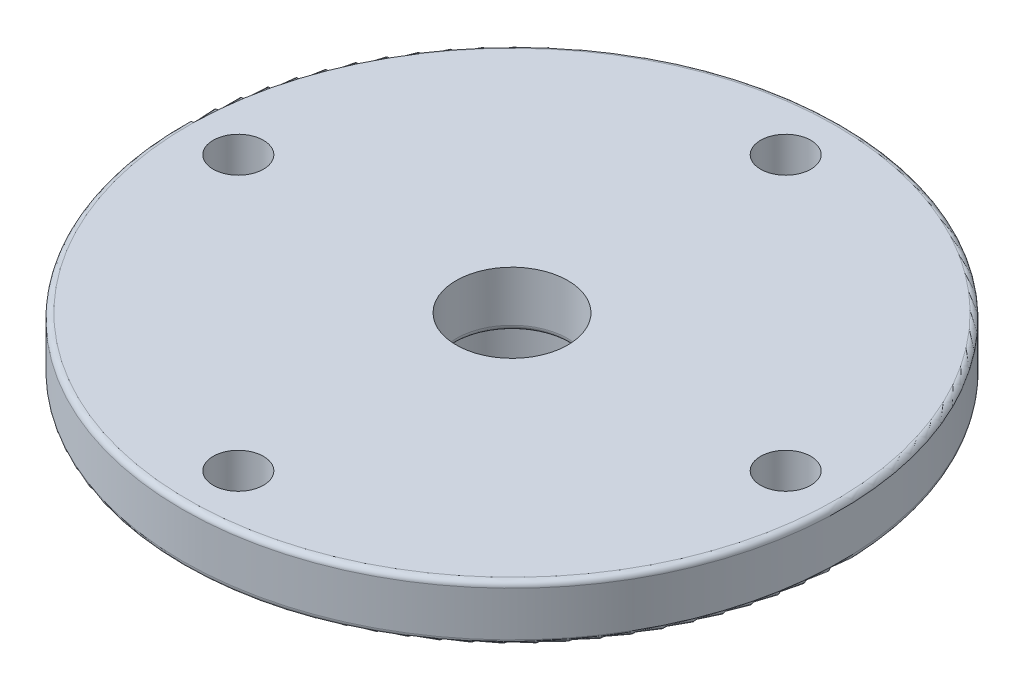
ISO-10303-21;
HEADER;
FILE_DESCRIPTION(('STEP AP214'),'2;1');
FILE_NAME('part.step','',(''),(''),'','','');
FILE_SCHEMA(('AUTOMOTIVE_DESIGN { 1 0 10303 214 1 1 1 1 }'));
ENDSEC;
DATA;
#1=APPLICATION_CONTEXT('core data for automotive mechanical design processes');
#2=APPLICATION_PROTOCOL_DEFINITION('international standard','automotive_design',2000,#1);
#3=PRODUCT_CONTEXT('',#1,'mechanical');
#4=PRODUCT('Part','Part','',(#3));
#5=PRODUCT_RELATED_PRODUCT_CATEGORY('part','',(#4));
#6=PRODUCT_DEFINITION_FORMATION('','',#4);
#7=PRODUCT_DEFINITION_CONTEXT('part definition',#1,'design');
#8=PRODUCT_DEFINITION('design','',#6,#7);
#9=PRODUCT_DEFINITION_SHAPE('','',#8);
#10=(LENGTH_UNIT() NAMED_UNIT(*) SI_UNIT(.MILLI.,.METRE.));
#11=(NAMED_UNIT(*) PLANE_ANGLE_UNIT() SI_UNIT($,.RADIAN.));
#12=(NAMED_UNIT(*) SI_UNIT($,.STERADIAN.) SOLID_ANGLE_UNIT());
#13=UNCERTAINTY_MEASURE_WITH_UNIT(LENGTH_MEASURE(1.E-05),#10,'distance_accuracy_value','');
#14=(GEOMETRIC_REPRESENTATION_CONTEXT(3) GLOBAL_UNCERTAINTY_ASSIGNED_CONTEXT((#13)) GLOBAL_UNIT_ASSIGNED_CONTEXT((#10,
#11,#12)) REPRESENTATION_CONTEXT('',''));
#15=CARTESIAN_POINT('',(0.,0.,0.));
#16=DIRECTION('',(0.,0.,1.));
#17=DIRECTION('',(1.,0.,0.));
#18=AXIS2_PLACEMENT_3D('',#15,#16,#17);
#19=CARTESIAN_POINT('',(-6.5,115.,0.));
#20=DIRECTION('',(0.,1.,0.));
#21=DIRECTION('',(0.,0.,1.));
#22=AXIS2_PLACEMENT_3D('',#19,#20,#21);
#23=PLANE('',#22);
#24=CARTESIAN_POINT('',(0.,115.,0.));
#25=DIRECTION('',(0.,1.,0.));
#26=DIRECTION('',(0.,0.,1.));
#27=AXIS2_PLACEMENT_3D('',#24,#25,#26);
#28=CIRCLE('',#27,6.);
#29=CARTESIAN_POINT('',(0.,115.,6.));
#30=VERTEX_POINT('',#29);
#31=EDGE_CURVE('E10',#30,#30,#28,.F.);
#32=ORIENTED_EDGE('',*,*,#31,.T.);
#33=EDGE_LOOP('',(#32));
#34=FACE_BOUND('',#33,.T.);
#35=CARTESIAN_POINT('',(0.,115.,0.));
#36=DIRECTION('',(0.,1.,0.));
#37=DIRECTION('',(0.,0.,1.));
#38=AXIS2_PLACEMENT_3D('',#35,#36,#37);
#39=CIRCLE('',#38,5.5);
#40=CARTESIAN_POINT('',(0.,115.,5.5));
#41=VERTEX_POINT('',#40);
#42=EDGE_CURVE('E97',#41,#41,#39,.T.);
#43=ORIENTED_EDGE('',*,*,#42,.T.);
#44=EDGE_LOOP('',(#43));
#45=FACE_BOUND('',#44,.T.);
#46=ADVANCED_FACE('F41',(#34,#45),#23,.F.);
#47=CARTESIAN_POINT('',(0.,105.,0.));
#48=DIRECTION('',(0.,-1.,0.));
#49=DIRECTION('',(0.,0.,-1.));
#50=AXIS2_PLACEMENT_3D('',#47,#48,#49);
#51=CYLINDRICAL_SURFACE('',#50,5.);
#52=CARTESIAN_POINT('',(0.,115.5,0.));
#53=DIRECTION('',(0.,1.,0.));
#54=DIRECTION('',(0.,0.,1.));
#55=AXIS2_PLACEMENT_3D('',#52,#53,#54);
#56=CIRCLE('',#55,5.);
#57=CARTESIAN_POINT('',(0.,115.5,5.));
#58=VERTEX_POINT('',#57);
#59=EDGE_CURVE('E101',#58,#58,#56,.F.);
#60=ORIENTED_EDGE('',*,*,#59,.T.);
#61=EDGE_LOOP('',(#60));
#62=FACE_BOUND('',#61,.T.);
#63=CARTESIAN_POINT('',(0.,120.,0.));
#64=DIRECTION('',(0.,-1.,0.));
#65=DIRECTION('',(0.,0.,-1.));
#66=AXIS2_PLACEMENT_3D('',#63,#64,#65);
#67=CIRCLE('',#66,5.);
#68=CARTESIAN_POINT('',(0.,120.,-5.));
#69=VERTEX_POINT('',#68);
#70=EDGE_CURVE('E105',#69,#69,#67,.T.);
#71=ORIENTED_EDGE('',*,*,#70,.F.);
#72=EDGE_LOOP('',(#71));
#73=FACE_BOUND('',#72,.T.);
#74=ADVANCED_FACE('F171',(#62,#73),#51,.F.);
#75=CARTESIAN_POINT('',(-29.5,120.,0.));
#76=DIRECTION('',(0.,-1.,0.));
#77=DIRECTION('',(0.,0.,-1.));
#78=AXIS2_PLACEMENT_3D('',#75,#76,#77);
#79=PLANE('',#78);
#80=CARTESIAN_POINT('',(0.,120.,0.));
#81=DIRECTION('',(0.,-1.,0.));
#82=DIRECTION('',(0.,0.,-1.));
#83=AXIS2_PLACEMENT_3D('',#80,#81,#82);
#84=CIRCLE('',#83,29.);
#85=CARTESIAN_POINT('',(0.,120.,-29.));
#86=VERTEX_POINT('',#85);
#87=EDGE_CURVE('E85',#86,#86,#84,.F.);
#88=ORIENTED_EDGE('',*,*,#87,.T.);
#89=EDGE_LOOP('',(#88));
#90=FACE_BOUND('',#89,.T.);
#91=CARTESIAN_POINT('',(-24.5,120.,0.));
#92=DIRECTION('',(0.,-1.,0.));
#93=DIRECTION('',(0.,0.,-1.));
#94=AXIS2_PLACEMENT_3D('',#91,#92,#93);
#95=CIRCLE('',#94,2.24999999999999);
#96=CARTESIAN_POINT('',(-24.5,120.,-2.24999999999999));
#97=VERTEX_POINT('',#96);
#98=EDGE_CURVE('E133',#97,#97,#95,.T.);
#99=ORIENTED_EDGE('',*,*,#98,.T.);
#100=EDGE_LOOP('',(#99));
#101=FACE_BOUND('',#100,.T.);
#102=CARTESIAN_POINT('',(0.,120.,24.5));
#103=DIRECTION('',(0.,-1.,0.));
#104=DIRECTION('',(0.,0.,-1.));
#105=AXIS2_PLACEMENT_3D('',#102,#103,#104);
#106=CIRCLE('',#105,2.24999999999999);
#107=CARTESIAN_POINT('',(0.,120.,22.25));
#108=VERTEX_POINT('',#107);
#109=EDGE_CURVE('E125',#108,#108,#106,.T.);
#110=ORIENTED_EDGE('',*,*,#109,.T.);
#111=EDGE_LOOP('',(#110));
#112=FACE_BOUND('',#111,.T.);
#113=CARTESIAN_POINT('',(24.5,120.,0.));
#114=DIRECTION('',(0.,-1.,0.));
#115=DIRECTION('',(0.,0.,-1.));
#116=AXIS2_PLACEMENT_3D('',#113,#114,#115);
#117=CIRCLE('',#116,2.24999999999999);
#118=CARTESIAN_POINT('',(24.5,120.,-2.24999999999999));
#119=VERTEX_POINT('',#118);
#120=EDGE_CURVE('E117',#119,#119,#117,.T.);
#121=ORIENTED_EDGE('',*,*,#120,.T.);
#122=EDGE_LOOP('',(#121));
#123=FACE_BOUND('',#122,.T.);
#124=CARTESIAN_POINT('',(0.,120.,-24.5));
#125=DIRECTION('',(0.,-1.,0.));
#126=DIRECTION('',(0.,0.,-1.));
#127=AXIS2_PLACEMENT_3D('',#124,#125,#126);
#128=CIRCLE('',#127,2.24999999999999);
#129=CARTESIAN_POINT('',(0.,120.,-26.75));
#130=VERTEX_POINT('',#129);
#131=EDGE_CURVE('E109',#130,#130,#128,.T.);
#132=ORIENTED_EDGE('',*,*,#131,.T.);
#133=EDGE_LOOP('',(#132));
#134=FACE_BOUND('',#133,.T.);
#135=ORIENTED_EDGE('',*,*,#70,.T.);
#136=EDGE_LOOP('',(#135));
#137=FACE_BOUND('',#136,.T.);
#138=ADVANCED_FACE('F176',(#90,#101,#112,#123,#134,#137),#79,.F.);
#139=CARTESIAN_POINT('',(0.,105.,0.));
#140=DIRECTION('',(0.,-1.,0.));
#141=DIRECTION('',(0.,0.,-1.));
#142=AXIS2_PLACEMENT_3D('',#139,#140,#141);
#143=CYLINDRICAL_SURFACE('',#142,29.5);
#144=CARTESIAN_POINT('',(0.,119.5,0.));
#145=DIRECTION('',(0.,-1.,0.));
#146=DIRECTION('',(0.,0.,-1.));
#147=AXIS2_PLACEMENT_3D('',#144,#145,#146);
#148=CIRCLE('',#147,29.5);
#149=CARTESIAN_POINT('',(0.,119.5,-29.5));
#150=VERTEX_POINT('',#149);
#151=EDGE_CURVE('E89',#150,#150,#148,.T.);
#152=ORIENTED_EDGE('',*,*,#151,.T.);
#153=EDGE_LOOP('',(#152));
#154=FACE_BOUND('',#153,.T.);
#155=CARTESIAN_POINT('',(0.,115.5,0.));
#156=DIRECTION('',(0.,1.,0.));
#157=DIRECTION('',(0.,0.,1.));
#158=AXIS2_PLACEMENT_3D('',#155,#156,#157);
#159=CIRCLE('',#158,29.5);
#160=CARTESIAN_POINT('',(0.,115.5,29.5));
#161=VERTEX_POINT('',#160);
#162=EDGE_CURVE('E93',#161,#161,#159,.T.);
#163=ORIENTED_EDGE('',*,*,#162,.T.);
#164=EDGE_LOOP('',(#163));
#165=FACE_BOUND('',#164,.T.);
#166=ADVANCED_FACE('F235',(#154,#165),#143,.T.);
#167=CARTESIAN_POINT('',(-9.5,115.,0.));
#168=DIRECTION('',(0.,1.,0.));
#169=DIRECTION('',(0.,0.,1.));
#170=AXIS2_PLACEMENT_3D('',#167,#168,#169);
#171=PLANE('',#170);
#172=CARTESIAN_POINT('',(0.,115.,0.));
#173=DIRECTION('',(0.,1.,0.));
#174=DIRECTION('',(0.,0.,1.));
#175=AXIS2_PLACEMENT_3D('',#172,#173,#174);
#176=CIRCLE('',#175,29.);
#177=CARTESIAN_POINT('',(0.,115.,29.));
#178=VERTEX_POINT('',#177);
#179=EDGE_CURVE('E77',#178,#178,#176,.F.);
#180=ORIENTED_EDGE('',*,*,#179,.T.);
#181=EDGE_LOOP('',(#180));
#182=FACE_BOUND('',#181,.T.);
#183=CARTESIAN_POINT('',(0.,115.,0.));
#184=DIRECTION('',(0.,1.,0.));
#185=DIRECTION('',(0.,0.,1.));
#186=AXIS2_PLACEMENT_3D('',#183,#184,#185);
#187=CIRCLE('',#186,10.);
#188=CARTESIAN_POINT('',(0.,115.,10.));
#189=VERTEX_POINT('',#188);
#190=EDGE_CURVE('E81',#189,#189,#187,.T.);
#191=ORIENTED_EDGE('',*,*,#190,.T.);
#192=EDGE_LOOP('',(#191));
#193=FACE_BOUND('',#192,.T.);
#194=CARTESIAN_POINT('',(-24.5,115.,0.));
#195=DIRECTION('',(0.,-1.,0.));
#196=DIRECTION('',(0.,0.,-1.));
#197=AXIS2_PLACEMENT_3D('',#194,#195,#196);
#198=CIRCLE('',#197,2.24999999999999);
#199=CARTESIAN_POINT('',(-24.5,115.,-2.24999999999999));
#200=VERTEX_POINT('',#199);
#201=EDGE_CURVE('E137',#200,#200,#198,.T.);
#202=ORIENTED_EDGE('',*,*,#201,.F.);
#203=EDGE_LOOP('',(#202));
#204=FACE_BOUND('',#203,.T.);
#205=CARTESIAN_POINT('',(0.,115.,24.5));
#206=DIRECTION('',(0.,-1.,0.));
#207=DIRECTION('',(0.,0.,-1.));
#208=AXIS2_PLACEMENT_3D('',#205,#206,#207);
#209=CIRCLE('',#208,2.24999999999999);
#210=CARTESIAN_POINT('',(0.,115.,22.25));
#211=VERTEX_POINT('',#210);
#212=EDGE_CURVE('E129',#211,#211,#209,.T.);
#213=ORIENTED_EDGE('',*,*,#212,.F.);
#214=EDGE_LOOP('',(#213));
#215=FACE_BOUND('',#214,.T.);
#216=CARTESIAN_POINT('',(24.5,115.,0.));
#217=DIRECTION('',(0.,-1.,0.));
#218=DIRECTION('',(0.,0.,-1.));
#219=AXIS2_PLACEMENT_3D('',#216,#217,#218);
#220=CIRCLE('',#219,2.24999999999999);
#221=CARTESIAN_POINT('',(24.5,115.,-2.24999999999999));
#222=VERTEX_POINT('',#221);
#223=EDGE_CURVE('E121',#222,#222,#220,.T.);
#224=ORIENTED_EDGE('',*,*,#223,.F.);
#225=EDGE_LOOP('',(#224));
#226=FACE_BOUND('',#225,.T.);
#227=CARTESIAN_POINT('',(0.,115.,-24.5));
#228=DIRECTION('',(0.,-1.,0.));
#229=DIRECTION('',(0.,0.,-1.));
#230=AXIS2_PLACEMENT_3D('',#227,#228,#229);
#231=CIRCLE('',#230,2.24999999999999);
#232=CARTESIAN_POINT('',(0.,115.,-26.75));
#233=VERTEX_POINT('',#232);
#234=EDGE_CURVE('E113',#233,#233,#231,.T.);
#235=ORIENTED_EDGE('',*,*,#234,.F.);
#236=EDGE_LOOP('',(#235));
#237=FACE_BOUND('',#236,.T.);
#238=ADVANCED_FACE('F231',(#182,#193,#204,#215,#226,#237),#171,.F.);
#239=CARTESIAN_POINT('',(0.,105.,0.));
#240=DIRECTION('',(0.,-1.,0.));
#241=DIRECTION('',(0.,0.,-1.));
#242=AXIS2_PLACEMENT_3D('',#239,#240,#241);
#243=CYLINDRICAL_SURFACE('',#242,9.5);
#244=CARTESIAN_POINT('',(-9.41740410091868,110.,-1.24999999999999));
#245=CARTESIAN_POINT('',(-9.41740515040742,110.069886205349,-1.24999704789293));
#246=CARTESIAN_POINT('',(-9.41819043981181,110.139815327445,-1.24411931466304));
#247=CARTESIAN_POINT('',(-9.42124533027014,110.277725224789,-1.22076605843336));
#248=CARTESIAN_POINT('',(-9.42351645694713,110.345703922418,-1.2032786145807));
#249=CARTESIAN_POINT('',(-9.42928142888536,110.477696420154,-1.1572323217496));
#250=CARTESIAN_POINT('',(-9.43277441749336,110.541712961235,-1.12868122804132));
#251=CARTESIAN_POINT('',(-9.44058851379836,110.664035077796,-1.06133513403108));
#252=CARTESIAN_POINT('',(-9.44490948670654,110.722341580491,-1.0225418006908));
#253=CARTESIAN_POINT('',(-9.45392261518461,110.831960501985,-0.935555536447476));
#254=CARTESIAN_POINT('',(-9.45861669074954,110.883232472384,-0.887311826136348));
#255=CARTESIAN_POINT('',(-9.46782988877771,110.976977226731,-0.782903691498034));
#256=CARTESIAN_POINT('',(-9.47234900230879,111.019449561922,-0.726738863459757));
#257=CARTESIAN_POINT('',(-9.48072286825033,111.094535628773,-0.607827237142816));
#258=CARTESIAN_POINT('',(-9.48457511969083,111.127112579641,-0.545057022732154));
#259=CARTESIAN_POINT('',(-9.49116007065744,111.181247447053,-0.41487734336002));
#260=CARTESIAN_POINT('',(-9.49389281603899,111.20280581493,-0.347468068548576));
#261=CARTESIAN_POINT('',(-9.4979173195322,111.234170222602,-0.210338313470613));
#262=CARTESIAN_POINT('',(-9.49921733795251,111.244043655884,-0.140633493799677));
#263=CARTESIAN_POINT('',(-9.50025814474571,111.251966884468,-0.000545054460519552));
#264=CARTESIAN_POINT('',(-9.49999900070088,111.250017192246,0.0698385356542006));
#265=CARTESIAN_POINT('',(-9.49795734365724,111.234403320736,0.208827747812643));
#266=CARTESIAN_POINT('',(-9.4961842570123,111.220811627099,0.277441670791973));
#267=CARTESIAN_POINT('',(-9.49132449458133,111.182412996434,0.411406214346115));
#268=CARTESIAN_POINT('',(-9.48823779157073,111.157605826965,0.476756767256544));
#269=CARTESIAN_POINT('',(-9.48108137373616,111.09740405726,0.602562678419372));
#270=CARTESIAN_POINT('',(-9.47700877286313,111.061978299016,0.663002955821209));
#271=CARTESIAN_POINT('',(-9.46833577460663,110.98156764371,0.777108144066745));
#272=CARTESIAN_POINT('',(-9.46373535042145,110.936582261133,0.830772710563963));
#273=CARTESIAN_POINT('',(-9.45447999803414,110.837923873158,0.930229349088635));
#274=CARTESIAN_POINT('',(-9.44982492089106,110.784187665752,0.975958735268482));
#275=CARTESIAN_POINT('',(-9.44101919770809,110.669769523819,1.05775916328446));
#276=CARTESIAN_POINT('',(-9.43686855357354,110.609087563058,1.09383016863954));
#277=CARTESIAN_POINT('',(-9.42954174057462,110.482442272949,1.1552946873874));
#278=CARTESIAN_POINT('',(-9.42636606200229,110.41647630733,1.18068283093786));
#279=CARTESIAN_POINT('',(-9.42135807082555,110.281166135925,1.22000353371584));
#280=CARTESIAN_POINT('',(-9.41952568621592,110.211822111427,1.23393670697445));
#281=CARTESIAN_POINT('',(-9.41742505133737,110.072278885302,1.24986821658864));
#282=CARTESIAN_POINT('',(-9.41714521920936,110.002089941338,1.25195492887753));
#283=CARTESIAN_POINT('',(-9.41815071410225,109.862363443552,1.24436778967091));
#284=CARTESIAN_POINT('',(-9.41943600405816,109.792825874345,1.23469421668076));
#285=CARTESIAN_POINT('',(-9.42341633828856,109.65664307734,1.20393565087208));
#286=CARTESIAN_POINT('',(-9.42610605718738,109.589987946535,1.1828937545738));
#287=CARTESIAN_POINT('',(-9.43258785218585,109.461151704626,1.13004032110573));
#288=CARTESIAN_POINT('',(-9.43637997094961,109.398970766795,1.09822836711485));
#289=CARTESIAN_POINT('',(-9.44466692307172,109.280449060262,1.02452177647129));
#290=CARTESIAN_POINT('',(-9.44916572917077,109.224144501115,0.982569368171447));
#291=CARTESIAN_POINT('',(-9.45834681086385,109.119343968871,0.889854075114491));
#292=CARTESIAN_POINT('',(-9.46302909437602,109.070848333238,0.839090809792198));
#293=CARTESIAN_POINT('',(-9.47208528996797,108.982730105689,0.729807943556198));
#294=CARTESIAN_POINT('',(-9.47645705911991,108.943165709042,0.671241214786109));
#295=CARTESIAN_POINT('',(-9.48436730464789,108.874436400601,0.548242056186275));
#296=CARTESIAN_POINT('',(-9.48790579935237,108.845271260061,0.483809755416941));
#297=CARTESIAN_POINT('',(-9.49374132443193,108.79826369334,0.351098939428531));
#298=CARTESIAN_POINT('',(-9.49604199025897,108.780388083095,0.282832344858804));
#299=CARTESIAN_POINT('',(-9.49915777375567,108.756359174225,0.144234307708302));
#300=CARTESIAN_POINT('',(-9.49997296602718,108.750205286923,0.0739029690011388));
#301=CARTESIAN_POINT('',(-9.50002550419145,108.749806338143,-0.0662608308191951));
#302=CARTESIAN_POINT('',(-9.49927471634213,108.755471715925,-0.136093049401187));
#303=CARTESIAN_POINT('',(-9.49630331821968,108.778360230814,-0.273803441283075));
#304=CARTESIAN_POINT('',(-9.49408270977212,108.795583353566,-0.341681617009858));
#305=CARTESIAN_POINT('',(-9.48842002745291,108.841069407478,-0.473542173562025));
#306=CARTESIAN_POINT('',(-9.48497848119331,108.869327570523,-0.537526223211862));
#307=CARTESIAN_POINT('',(-9.47725424463943,108.936072250293,-0.659858449122204));
#308=CARTESIAN_POINT('',(-9.47297153999953,108.974558941465,-0.718206529238161));
#309=CARTESIAN_POINT('',(-9.46400385926268,109.060997805309,-0.828067366506168));
#310=CARTESIAN_POINT('',(-9.45931619411569,109.109016519325,-0.879527552763566));
#311=CARTESIAN_POINT('',(-9.45008808874873,109.213017351824,-0.9736938777279));
#312=CARTESIAN_POINT('',(-9.44554768356159,109.269001348413,-1.01639794604752));
#313=CARTESIAN_POINT('',(-9.43710744957151,109.387620479169,-1.09199840888499));
#314=CARTESIAN_POINT('',(-9.43321044460901,109.450283045588,-1.12485205925342));
#315=CARTESIAN_POINT('',(-9.42653130552799,109.580253766044,-1.17952229042332));
#316=CARTESIAN_POINT('',(-9.42374797311329,109.647556835023,-1.20135074085916));
#317=CARTESIAN_POINT('',(-9.42027915781916,109.762664568872,-1.22819129159687));
#318=CARTESIAN_POINT('',(-9.41920646480158,109.809746593527,-1.23635761509663));
#319=CARTESIAN_POINT('',(-9.41776858101801,109.904545741081,-1.24726295373764));
#320=CARTESIAN_POINT('',(-9.41740338404484,109.952262858405,-1.25000201649454));
#321=CARTESIAN_POINT('',(-9.41740410091868,110.,-1.24999999999999));
#322=B_SPLINE_CURVE_WITH_KNOTS('',3,(#244,#245,#246,#247,#248,#249,#250,#251,#252,#253,#254,
#255,#256,#257,#258,#259,#260,#261,#262,#263,#264,#265,#266,#267,#268,#269,#270,#271,#272,#273,
#274,#275,#276,#277,#278,#279,#280,#281,#282,#283,#284,#285,#286,#287,#288,#289,#290,#291,#292,
#293,#294,#295,#296,#297,#298,#299,#300,#301,#302,#303,#304,#305,#306,#307,#308,#309,#310,#311,
#312,#313,#314,#315,#316,#317,#318,#319,#320,#321),.UNSPECIFIED.,.T.,.F.,(4,2,2,2,2,2,2,2,2,2,2,
2,2,2,2,2,2,2,2,2,2,2,2,2,2,2,2,2,2,2,2,2,2,2,2,2,2,2,4),(0.,0.209484202571712,
0.419183836928705,0.628736743572684,0.838255565722038,1.04893269923857,1.2596205740993,
1.47108224647857,1.68253525643094,1.89276266234727,2.10298095597087,2.31189982011463,
2.52082301429179,2.73036535278697,2.93991833609115,3.15105801722778,3.36219849585732,
3.57344497984327,3.78468013945542,3.99433736908822,4.2039896337458,4.41285264161177,
4.62172373378566,4.83181406846403,5.04191347978166,5.25334471898744,5.46477130718729,
5.6755735069056,5.88636511965184,6.09556525763882,6.30476513579177,6.51387472089916,
6.72298787259739,6.93361567574767,7.14429322463347,7.35587216352336,7.56722283023417,
7.71031637390364,7.85340866214714),.UNSPECIFIED.);
#323=CARTESIAN_POINT('',(-9.41740410091868,110.,-1.24999999999999));
#324=VERTEX_POINT('',#323);
#325=EDGE_CURVE('E150',#324,#324,#322,.T.);
#326=ORIENTED_EDGE('',*,*,#325,.T.);
#327=EDGE_LOOP('',(#326));
#328=FACE_BOUND('',#327,.T.);
#329=CARTESIAN_POINT('',(0.,105.5,0.));
#330=DIRECTION('',(0.,1.,0.));
#331=DIRECTION('',(0.,0.,1.));
#332=AXIS2_PLACEMENT_3D('',#329,#330,#331);
#333=CIRCLE('',#332,9.5);
#334=CARTESIAN_POINT('',(0.,105.5,9.5));
#335=VERTEX_POINT('',#334);
#336=EDGE_CURVE('E65',#335,#335,#333,.T.);
#337=ORIENTED_EDGE('',*,*,#336,.T.);
#338=EDGE_LOOP('',(#337));
#339=FACE_BOUND('',#338,.T.);
#340=CARTESIAN_POINT('',(0.,114.5,0.));
#341=DIRECTION('',(0.,1.,0.));
#342=DIRECTION('',(0.,0.,1.));
#343=AXIS2_PLACEMENT_3D('',#340,#341,#342);
#344=CIRCLE('',#343,9.5);
#345=CARTESIAN_POINT('',(0.,114.5,9.5));
#346=VERTEX_POINT('',#345);
#347=EDGE_CURVE('E69',#346,#346,#344,.F.);
#348=ORIENTED_EDGE('',*,*,#347,.T.);
#349=EDGE_LOOP('',(#348));
#350=FACE_BOUND('',#349,.T.);
#351=ADVANCED_FACE('F225',(#328,#339,#350),#243,.T.);
#352=CARTESIAN_POINT('',(-6.5,105.,0.));
#353=DIRECTION('',(0.,1.,0.));
#354=DIRECTION('',(0.,0.,1.));
#355=AXIS2_PLACEMENT_3D('',#352,#353,#354);
#356=PLANE('',#355);
#357=CARTESIAN_POINT('',(0.,105.,0.));
#358=DIRECTION('',(0.,1.,0.));
#359=DIRECTION('',(0.,0.,1.));
#360=AXIS2_PLACEMENT_3D('',#357,#358,#359);
#361=CIRCLE('',#360,7.);
#362=CARTESIAN_POINT('',(0.,105.,7.));
#363=VERTEX_POINT('',#362);
#364=EDGE_CURVE('E49',#363,#363,#361,.T.);
#365=ORIENTED_EDGE('',*,*,#364,.T.);
#366=EDGE_LOOP('',(#365));
#367=FACE_BOUND('',#366,.T.);
#368=CARTESIAN_POINT('',(0.,105.,0.));
#369=DIRECTION('',(0.,1.,0.));
#370=DIRECTION('',(0.,0.,1.));
#371=AXIS2_PLACEMENT_3D('',#368,#369,#370);
#372=CIRCLE('',#371,9.);
#373=CARTESIAN_POINT('',(0.,105.,9.));
#374=VERTEX_POINT('',#373);
#375=EDGE_CURVE('E73',#374,#374,#372,.F.);
#376=ORIENTED_EDGE('',*,*,#375,.T.);
#377=EDGE_LOOP('',(#376));
#378=FACE_BOUND('',#377,.T.);
#379=ADVANCED_FACE('F213',(#367,#378),#356,.F.);
#380=CARTESIAN_POINT('',(0.,105.,0.));
#381=DIRECTION('',(0.,-1.,0.));
#382=DIRECTION('',(0.,0.,-1.));
#383=AXIS2_PLACEMENT_3D('',#380,#381,#382);
#384=CYLINDRICAL_SURFACE('',#383,6.5);
#385=CARTESIAN_POINT('',(-6.5,108.75,0.));
#386=CARTESIAN_POINT('',(-6.49999873054918,108.75000262061,0.0695263300903777));
#387=CARTESIAN_POINT('',(-6.49887299034978,108.755820293649,0.139086386536078));
#388=CARTESIAN_POINT('',(-6.49449072478032,108.778920972431,0.276244066545679));
#389=CARTESIAN_POINT('',(-6.49123244093526,108.796213440343,0.343840022447296));
#390=CARTESIAN_POINT('',(-6.48294932466697,108.841712790244,0.475066268731183));
#391=CARTESIAN_POINT('',(-6.47792612463065,108.869909589137,0.538700159856868));
#392=CARTESIAN_POINT('',(-6.46666077439192,108.936388063963,0.660328619211793));
#393=CARTESIAN_POINT('',(-6.46041871297687,108.974669005393,0.718323597744219));
#394=CARTESIAN_POINT('',(-6.44731615012176,109.060739582854,0.827762164871103));
#395=CARTESIAN_POINT('',(-6.44044947743084,109.108631415726,0.879124647683762));
#396=CARTESIAN_POINT('',(-6.42691706808667,109.212344518597,0.973138343078074));
#397=CARTESIAN_POINT('',(-6.42025134636388,109.268166376038,1.01578890972675));
#398=CARTESIAN_POINT('',(-6.40781547009761,109.386731997679,1.0915083981031));
#399=CARTESIAN_POINT('',(-6.40205326632548,109.44952971555,1.12449425725112));
#400=CARTESIAN_POINT('',(-6.39216406280366,109.579904955013,1.17941610157592));
#401=CARTESIAN_POINT('',(-6.38803691434868,109.647482041271,1.20135309167638));
#402=CARTESIAN_POINT('',(-6.38194735063819,109.78462809586,1.23329305228568));
#403=CARTESIAN_POINT('',(-6.37995924110286,109.854162883349,1.2434377939577));
#404=CARTESIAN_POINT('',(-6.37829543879725,109.99397381846,1.25194545092379));
#405=CARTESIAN_POINT('',(-6.3786195277321,110.064249895472,1.25030947843595));
#406=CARTESIAN_POINT('',(-6.38152012920898,110.202517611581,1.23541697804275));
#407=CARTESIAN_POINT('',(-6.38406529733109,110.270527422382,1.22232215325025));
#408=CARTESIAN_POINT('',(-6.39107200195107,110.403366491558,1.18513854067888));
#409=CARTESIAN_POINT('',(-6.39553362370363,110.468195608294,1.16104926380164));
#410=CARTESIAN_POINT('',(-6.40590301761788,110.59330347191,1.10240382729655));
#411=CARTESIAN_POINT('',(-6.41181970353635,110.653551055254,1.06778282798613));
#412=CARTESIAN_POINT('',(-6.42442673553149,110.767442485569,0.989102525446724));
#413=CARTESIAN_POINT('',(-6.43111716402495,110.821085627796,0.94504221634322));
#414=CARTESIAN_POINT('',(-6.44465411904849,110.92117926711,0.847864455663331));
#415=CARTESIAN_POINT('',(-6.45150139326972,110.967495595018,0.794608805779961));
#416=CARTESIAN_POINT('',(-6.46447860514488,111.05055775365,0.681013328076993));
#417=CARTESIAN_POINT('',(-6.47060853487937,111.087303478721,0.620673422062238));
#418=CARTESIAN_POINT('',(-6.48147374305158,111.15020302352,0.494478881244396));
#419=CARTESIAN_POINT('',(-6.48620711303174,111.176342367309,0.428616856521533));
#420=CARTESIAN_POINT('',(-6.49373123608211,111.217148711673,0.293325284598558));
#421=CARTESIAN_POINT('',(-6.4965222064135,111.231816995333,0.223896137321171));
#422=CARTESIAN_POINT('',(-6.4998170641524,111.249076883077,0.084594957572311));
#423=CARTESIAN_POINT('',(-6.50035574677272,111.251852235921,0.014746488997661));
#424=CARTESIAN_POINT('',(-6.49918164994221,111.245741111402,-0.12441631829641));
#425=CARTESIAN_POINT('',(-6.497468987103,111.236855238049,-0.193730684493373));
#426=CARTESIAN_POINT('',(-6.49200634359787,111.207826628002,-0.329271121290108));
#427=CARTESIAN_POINT('',(-6.48827328656802,111.187777360787,-0.395517951862495));
#428=CARTESIAN_POINT('',(-6.47918677244289,111.137092609938,-0.523709778000943));
#429=CARTESIAN_POINT('',(-6.47383320094063,111.106456378851,-0.585654469459843));
#430=CARTESIAN_POINT('',(-6.46201273267351,111.035064128413,-0.704264341336219));
#431=CARTESIAN_POINT('',(-6.4555338112679,110.994196454232,-0.760861092631647));
#432=CARTESIAN_POINT('',(-6.44221127589378,110.903651888251,-0.866459302715507));
#433=CARTESIAN_POINT('',(-6.43536762602225,110.853974128083,-0.915460011904454));
#434=CARTESIAN_POINT('',(-6.42197081919612,110.746385919302,-1.0051775508243));
#435=CARTESIAN_POINT('',(-6.41542307578637,110.688369874859,-1.04576869619255));
#436=CARTESIAN_POINT('',(-6.40347051879715,110.566234837863,-1.11662974416658));
#437=CARTESIAN_POINT('',(-6.39806566143698,110.502116079226,-1.14690004216186));
#438=CARTESIAN_POINT('',(-6.38905378658871,110.369906820527,-1.19608442093858));
#439=CARTESIAN_POINT('',(-6.38543785792601,110.301837933266,-1.21505488797638));
#440=CARTESIAN_POINT('',(-6.38039343660705,110.163402463397,-1.24127395271722));
#441=CARTESIAN_POINT('',(-6.37896468278173,110.093036156146,-1.24852394995943));
#442=CARTESIAN_POINT('',(-6.37847010253234,109.953263322039,-1.25104755843672));
#443=CARTESIAN_POINT('',(-6.37936513521924,109.883860438516,-1.24651955106102));
#444=CARTESIAN_POINT('',(-6.3833302398308,109.746825027747,-1.22605133269019));
#445=CARTESIAN_POINT('',(-6.38640029712568,109.679192488596,-1.21011119845592));
#446=CARTESIAN_POINT('',(-6.39435266298136,109.547731690079,-1.16735673858748));
#447=CARTESIAN_POINT('',(-6.39923121033494,109.483895852041,-1.14056497100193));
#448=CARTESIAN_POINT('',(-6.4102533266987,109.361593819055,-1.07688985392762));
#449=CARTESIAN_POINT('',(-6.41639699144119,109.303128030946,-1.04000574067458));
#450=CARTESIAN_POINT('',(-6.42937795151368,109.192234212658,-0.956507819072124));
#451=CARTESIAN_POINT('',(-6.43622463982556,109.139915659259,-0.909750049269207));
#452=CARTESIAN_POINT('',(-6.44977101580729,109.043801312253,-0.808131192425024));
#453=CARTESIAN_POINT('',(-6.45647066935191,109.000007478966,-0.753268246630355));
#454=CARTESIAN_POINT('',(-6.46904328529454,108.921793491572,-0.6363681286733));
#455=CARTESIAN_POINT('',(-6.47490774506217,108.887466814965,-0.574267467434694));
#456=CARTESIAN_POINT('',(-6.48506595383496,108.829789603818,-0.445086129675195));
#457=CARTESIAN_POINT('',(-6.48936115496814,108.806428916066,-0.378010126647418));
#458=CARTESIAN_POINT('',(-6.49503671875109,108.776007707893,-0.258961782852765));
#459=CARTESIAN_POINT('',(-6.49688729501668,108.766271755124,-0.207678719850832));
#460=CARTESIAN_POINT('',(-6.49936939476943,108.753267008181,-0.104270079257339));
#461=CARTESIAN_POINT('',(-6.50000095208405,108.749998034551,-0.0521445250851613));
#462=CARTESIAN_POINT('',(-6.5,108.75,0.));
#463=B_SPLINE_CURVE_WITH_KNOTS('',3,(#385,#386,#387,#388,#389,#390,#391,#392,#393,#394,#395,
#396,#397,#398,#399,#400,#401,#402,#403,#404,#405,#406,#407,#408,#409,#410,#411,#412,#413,#414,
#415,#416,#417,#418,#419,#420,#421,#422,#423,#424,#425,#426,#427,#428,#429,#430,#431,#432,#433,
#434,#435,#436,#437,#438,#439,#440,#441,#442,#443,#444,#445,#446,#447,#448,#449,#450,#451,#452,
#453,#454,#455,#456,#457,#458,#459,#460,#461,#462),.UNSPECIFIED.,.T.,.F.,(4,2,2,2,2,2,2,2,2,2,2,
2,2,2,2,2,2,2,2,2,2,2,2,2,2,2,2,2,2,2,2,2,2,2,2,2,2,2,4),(0.,0.208388270286284,
0.416948592398255,0.625316520786644,0.83366927637291,1.04436766202049,1.2550816639426,
1.46755680912119,1.68001262563572,1.88988689492411,2.09974135022728,2.30668132349718,
2.51363050358032,2.72188049935151,2.93015269776837,3.14188196787823,3.35361357524974,
3.56563319670018,3.77762909953161,3.98633752849761,4.19503514754151,4.40201109247078,
4.60900165313822,4.81835785477022,5.02773470314614,5.24004512383245,5.45234741003692,
5.66358123272482,5.87478983015674,6.08246408561766,6.29013694422217,6.4973802964249,
6.70463933664283,6.91515952159819,7.12572806013486,7.33830680136686,7.55068832965357,
7.70698320273407,7.86327373861122),.UNSPECIFIED.);
#464=CARTESIAN_POINT('',(-6.5,108.75,0.));
#465=VERTEX_POINT('',#464);
#466=EDGE_CURVE('E141',#465,#465,#463,.T.);
#467=ORIENTED_EDGE('',*,*,#466,.T.);
#468=EDGE_LOOP('',(#467));
#469=FACE_BOUND('',#468,.T.);
#470=CARTESIAN_POINT('',(0.,105.5,0.));
#471=DIRECTION('',(0.,1.,0.));
#472=DIRECTION('',(0.,0.,1.));
#473=AXIS2_PLACEMENT_3D('',#470,#471,#472);
#474=CIRCLE('',#473,6.5);
#475=CARTESIAN_POINT('',(0.,105.5,6.5));
#476=VERTEX_POINT('',#475);
#477=EDGE_CURVE('E54',#476,#476,#474,.F.);
#478=ORIENTED_EDGE('',*,*,#477,.T.);
#479=EDGE_LOOP('',(#478));
#480=FACE_BOUND('',#479,.T.);
#481=CARTESIAN_POINT('',(0.,114.5,0.));
#482=DIRECTION('',(0.,1.,0.));
#483=DIRECTION('',(0.,0.,1.));
#484=AXIS2_PLACEMENT_3D('',#481,#482,#483);
#485=CIRCLE('',#484,6.5);
#486=CARTESIAN_POINT('',(0.,114.5,6.5));
#487=VERTEX_POINT('',#486);
#488=EDGE_CURVE('E59',#487,#487,#485,.T.);
#489=ORIENTED_EDGE('',*,*,#488,.T.);
#490=EDGE_LOOP('',(#489));
#491=FACE_BOUND('',#490,.T.);
#492=ADVANCED_FACE('F209',(#469,#480,#491),#384,.F.);
#493=CARTESIAN_POINT('',(0.,115.,-24.5));
#494=DIRECTION('',(0.,-1.,0.));
#495=DIRECTION('',(0.,0.,-1.));
#496=AXIS2_PLACEMENT_3D('',#493,#494,#495);
#497=CYLINDRICAL_SURFACE('',#496,2.24999999999999);
#498=ORIENTED_EDGE('',*,*,#234,.T.);
#499=EDGE_LOOP('',(#498));
#500=FACE_BOUND('',#499,.T.);
#501=ORIENTED_EDGE('',*,*,#131,.F.);
#502=EDGE_LOOP('',(#501));
#503=FACE_BOUND('',#502,.T.);
#504=ADVANCED_FACE('F212',(#500,#503),#497,.F.);
#505=CARTESIAN_POINT('',(24.5,115.,0.));
#506=DIRECTION('',(0.,-1.,0.));
#507=DIRECTION('',(0.,0.,-1.));
#508=AXIS2_PLACEMENT_3D('',#505,#506,#507);
#509=CYLINDRICAL_SURFACE('',#508,2.24999999999999);
#510=ORIENTED_EDGE('',*,*,#223,.T.);
#511=EDGE_LOOP('',(#510));
#512=FACE_BOUND('',#511,.T.);
#513=ORIENTED_EDGE('',*,*,#120,.F.);
#514=EDGE_LOOP('',(#513));
#515=FACE_BOUND('',#514,.T.);
#516=ADVANCED_FACE('F222',(#512,#515),#509,.F.);
#517=CARTESIAN_POINT('',(0.,115.,24.5));
#518=DIRECTION('',(0.,-1.,0.));
#519=DIRECTION('',(0.,0.,-1.));
#520=AXIS2_PLACEMENT_3D('',#517,#518,#519);
#521=CYLINDRICAL_SURFACE('',#520,2.24999999999999);
#522=ORIENTED_EDGE('',*,*,#212,.T.);
#523=EDGE_LOOP('',(#522));
#524=FACE_BOUND('',#523,.T.);
#525=ORIENTED_EDGE('',*,*,#109,.F.);
#526=EDGE_LOOP('',(#525));
#527=FACE_BOUND('',#526,.T.);
#528=ADVANCED_FACE('F258',(#524,#527),#521,.F.);
#529=CARTESIAN_POINT('',(-24.5,115.,0.));
#530=DIRECTION('',(0.,-1.,0.));
#531=DIRECTION('',(0.,0.,-1.));
#532=AXIS2_PLACEMENT_3D('',#529,#530,#531);
#533=CYLINDRICAL_SURFACE('',#532,2.24999999999999);
#534=ORIENTED_EDGE('',*,*,#201,.T.);
#535=EDGE_LOOP('',(#534));
#536=FACE_BOUND('',#535,.T.);
#537=ORIENTED_EDGE('',*,*,#98,.F.);
#538=EDGE_LOOP('',(#537));
#539=FACE_BOUND('',#538,.T.);
#540=ADVANCED_FACE('F186',(#536,#539),#533,.F.);
#541=CARTESIAN_POINT('',(0.,115.5,0.));
#542=DIRECTION('',(0.,1.,0.));
#543=DIRECTION('',(0.,0.,1.));
#544=AXIS2_PLACEMENT_3D('',#541,#542,#543);
#545=TOROIDAL_SURFACE('',#544,5.5,0.5);
#546=ORIENTED_EDGE('',*,*,#42,.F.);
#547=EDGE_LOOP('',(#546));
#548=FACE_BOUND('',#547,.T.);
#549=ORIENTED_EDGE('',*,*,#59,.F.);
#550=EDGE_LOOP('',(#549));
#551=FACE_BOUND('',#550,.T.);
#552=ADVANCED_FACE('F182',(#548,#551),#545,.T.);
#553=CARTESIAN_POINT('',(0.,119.5,0.));
#554=DIRECTION('',(0.,-1.,0.));
#555=DIRECTION('',(0.,0.,-1.));
#556=AXIS2_PLACEMENT_3D('',#553,#554,#555);
#557=TOROIDAL_SURFACE('',#556,29.,0.5);
#558=ORIENTED_EDGE('',*,*,#87,.F.);
#559=EDGE_LOOP('',(#558));
#560=FACE_BOUND('',#559,.T.);
#561=ORIENTED_EDGE('',*,*,#151,.F.);
#562=EDGE_LOOP('',(#561));
#563=FACE_BOUND('',#562,.T.);
#564=ADVANCED_FACE('F185',(#560,#563),#557,.T.);
#565=CARTESIAN_POINT('',(0.,115.5,0.));
#566=DIRECTION('',(0.,1.,0.));
#567=DIRECTION('',(0.,0.,1.));
#568=AXIS2_PLACEMENT_3D('',#565,#566,#567);
#569=TOROIDAL_SURFACE('',#568,29.,0.5);
#570=ORIENTED_EDGE('',*,*,#162,.F.);
#571=EDGE_LOOP('',(#570));
#572=FACE_BOUND('',#571,.T.);
#573=ORIENTED_EDGE('',*,*,#179,.F.);
#574=EDGE_LOOP('',(#573));
#575=FACE_BOUND('',#574,.T.);
#576=ADVANCED_FACE('F190',(#572,#575),#569,.T.);
#577=CARTESIAN_POINT('',(0.,105.5,0.));
#578=DIRECTION('',(0.,1.,0.));
#579=DIRECTION('',(0.,0.,1.));
#580=AXIS2_PLACEMENT_3D('',#577,#578,#579);
#581=TOROIDAL_SURFACE('',#580,9.,0.5);
#582=ORIENTED_EDGE('',*,*,#336,.F.);
#583=EDGE_LOOP('',(#582));
#584=FACE_BOUND('',#583,.T.);
#585=ORIENTED_EDGE('',*,*,#375,.F.);
#586=EDGE_LOOP('',(#585));
#587=FACE_BOUND('',#586,.T.);
#588=ADVANCED_FACE('F194',(#584,#587),#581,.T.);
#589=CARTESIAN_POINT('',(0.,114.5,0.));
#590=DIRECTION('',(0.,1.,0.));
#591=DIRECTION('',(0.,0.,1.));
#592=AXIS2_PLACEMENT_3D('',#589,#590,#591);
#593=TOROIDAL_SURFACE('',#592,10.,0.5);
#594=ORIENTED_EDGE('',*,*,#190,.F.);
#595=EDGE_LOOP('',(#594));
#596=FACE_BOUND('',#595,.T.);
#597=ORIENTED_EDGE('',*,*,#347,.F.);
#598=EDGE_LOOP('',(#597));
#599=FACE_BOUND('',#598,.T.);
#600=ADVANCED_FACE('F198',(#596,#599),#593,.F.);
#601=CARTESIAN_POINT('',(0.,105.5,0.));
#602=DIRECTION('',(0.,1.,0.));
#603=DIRECTION('',(0.,0.,1.));
#604=AXIS2_PLACEMENT_3D('',#601,#602,#603);
#605=TOROIDAL_SURFACE('',#604,7.,0.5);
#606=ORIENTED_EDGE('',*,*,#364,.F.);
#607=EDGE_LOOP('',(#606));
#608=FACE_BOUND('',#607,.T.);
#609=ORIENTED_EDGE('',*,*,#477,.F.);
#610=EDGE_LOOP('',(#609));
#611=FACE_BOUND('',#610,.T.);
#612=ADVANCED_FACE('F166',(#608,#611),#605,.T.);
#613=CARTESIAN_POINT('',(0.,114.5,0.));
#614=DIRECTION('',(0.,1.,0.));
#615=DIRECTION('',(0.,0.,1.));
#616=AXIS2_PLACEMENT_3D('',#613,#614,#615);
#617=TOROIDAL_SURFACE('',#616,6.,0.5);
#618=ORIENTED_EDGE('',*,*,#488,.F.);
#619=EDGE_LOOP('',(#618));
#620=FACE_BOUND('',#619,.T.);
#621=ORIENTED_EDGE('',*,*,#31,.F.);
#622=EDGE_LOOP('',(#621));
#623=FACE_BOUND('',#622,.T.);
#624=ADVANCED_FACE('F43',(#620,#623),#617,.F.);
#625=CARTESIAN_POINT('',(-6.5,110.,0.));
#626=DIRECTION('',(1.,0.,0.));
#627=DIRECTION('',(0.,0.,-1.));
#628=AXIS2_PLACEMENT_3D('',#625,#626,#627);
#629=CYLINDRICAL_SURFACE('',#628,1.24999999999999);
#630=ORIENTED_EDGE('',*,*,#466,.F.);
#631=EDGE_LOOP('',(#630));
#632=FACE_BOUND('',#631,.T.);
#633=ORIENTED_EDGE('',*,*,#325,.F.);
#634=EDGE_LOOP('',(#633));
#635=FACE_BOUND('',#634,.T.);
#636=ADVANCED_FACE('F158',(#632,#635),#629,.F.);
#637=CLOSED_SHELL('',(#46,#74,#138,#166,#238,#351,#379,#492,#504,#516,#528,#540,#552,#564,#576,
#588,#600,#612,#624,#636));
#638=MANIFOLD_SOLID_BREP('B2',#637);
#639=ADVANCED_BREP_SHAPE_REPRESENTATION('',(#18,#638),#14);
#640=SHAPE_DEFINITION_REPRESENTATION(#9,#639);
ENDSEC;
END-ISO-10303-21;
